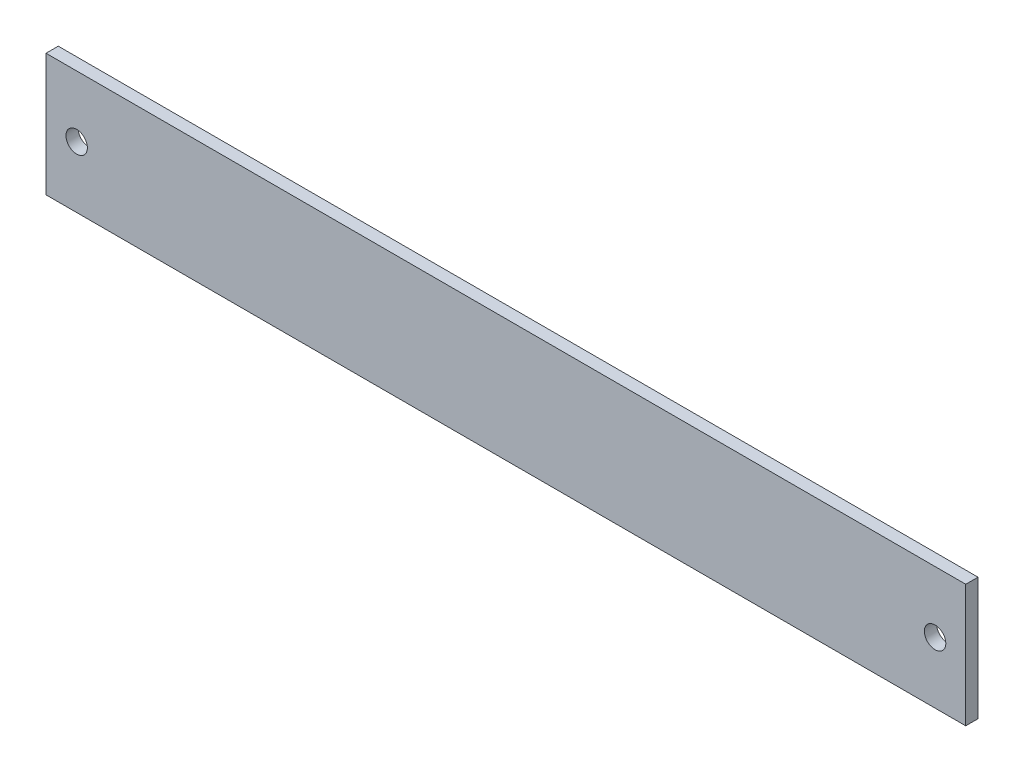
ISO-10303-21;
HEADER;
FILE_DESCRIPTION(('STEP AP214'),'2;1');
FILE_NAME('part.step','',(''),(''),'','','');
FILE_SCHEMA(('AUTOMOTIVE_DESIGN { 1 0 10303 214 1 1 1 1 }'));
ENDSEC;
DATA;
#1=APPLICATION_CONTEXT('core data for automotive mechanical design processes');
#2=APPLICATION_PROTOCOL_DEFINITION('international standard','automotive_design',2000,#1);
#3=PRODUCT_CONTEXT('',#1,'mechanical');
#4=PRODUCT('Part','Part','',(#3));
#5=PRODUCT_RELATED_PRODUCT_CATEGORY('part','',(#4));
#6=PRODUCT_DEFINITION_FORMATION('','',#4);
#7=PRODUCT_DEFINITION_CONTEXT('part definition',#1,'design');
#8=PRODUCT_DEFINITION('design','',#6,#7);
#9=PRODUCT_DEFINITION_SHAPE('','',#8);
#10=(LENGTH_UNIT() NAMED_UNIT(*) SI_UNIT(.MILLI.,.METRE.));
#11=(NAMED_UNIT(*) PLANE_ANGLE_UNIT() SI_UNIT($,.RADIAN.));
#12=(NAMED_UNIT(*) SI_UNIT($,.STERADIAN.) SOLID_ANGLE_UNIT());
#13=UNCERTAINTY_MEASURE_WITH_UNIT(LENGTH_MEASURE(1.E-05),#10,'distance_accuracy_value','');
#14=(GEOMETRIC_REPRESENTATION_CONTEXT(3) GLOBAL_UNCERTAINTY_ASSIGNED_CONTEXT((#13)) GLOBAL_UNIT_ASSIGNED_CONTEXT((#10,
#11,#12)) REPRESENTATION_CONTEXT('',''));
#15=CARTESIAN_POINT('',(0.,0.,0.));
#16=DIRECTION('',(0.,0.,1.));
#17=DIRECTION('',(1.,0.,0.));
#18=AXIS2_PLACEMENT_3D('',#15,#16,#17);
#19=CARTESIAN_POINT('',(75.,-10.,2.));
#20=DIRECTION('',(-1.,0.,0.));
#21=DIRECTION('',(0.,0.,1.));
#22=AXIS2_PLACEMENT_3D('',#19,#20,#21);
#23=PLANE('',#22);
#24=DIRECTION('',(0.,1.,0.));
#25=VECTOR('',#24,1.);
#26=CARTESIAN_POINT('',(75.,-10.,0.));
#27=LINE('',#26,#25);
#28=CARTESIAN_POINT('',(75.,-10.,0.));
#29=VERTEX_POINT('',#28);
#30=CARTESIAN_POINT('',(75.,10.,0.));
#31=VERTEX_POINT('',#30);
#32=EDGE_CURVE('E113',#29,#31,#27,.T.);
#33=ORIENTED_EDGE('',*,*,#32,.T.);
#34=DIRECTION('',(0.,0.,-1.));
#35=VECTOR('',#34,1.);
#36=CARTESIAN_POINT('',(75.,10.,2.));
#37=LINE('',#36,#35);
#38=CARTESIAN_POINT('',(75.,10.,2.));
#39=VERTEX_POINT('',#38);
#40=EDGE_CURVE('E11',#39,#31,#37,.T.);
#41=ORIENTED_EDGE('',*,*,#40,.F.);
#42=DIRECTION('',(0.,1.,0.));
#43=VECTOR('',#42,1.);
#44=CARTESIAN_POINT('',(75.,-10.,2.));
#45=LINE('',#44,#43);
#46=CARTESIAN_POINT('',(75.,-10.,2.));
#47=VERTEX_POINT('',#46);
#48=EDGE_CURVE('E97',#47,#39,#45,.T.);
#49=ORIENTED_EDGE('',*,*,#48,.F.);
#50=DIRECTION('',(0.,0.,-1.));
#51=VECTOR('',#50,1.);
#52=CARTESIAN_POINT('',(75.,-10.,2.));
#53=LINE('',#52,#51);
#54=EDGE_CURVE('E109',#47,#29,#53,.T.);
#55=ORIENTED_EDGE('',*,*,#54,.T.);
#56=EDGE_LOOP('',(#33,#41,#49,#55));
#57=FACE_BOUND('',#56,.T.);
#58=ADVANCED_FACE('F45',(#57),#23,.F.);
#59=CARTESIAN_POINT('',(-75.,10.,2.));
#60=DIRECTION('',(0.,-1.,0.));
#61=DIRECTION('',(0.,0.,-1.));
#62=AXIS2_PLACEMENT_3D('',#59,#60,#61);
#63=PLANE('',#62);
#64=DIRECTION('',(-1.,0.,0.));
#65=VECTOR('',#64,1.);
#66=CARTESIAN_POINT('',(-75.,10.,0.));
#67=LINE('',#66,#65);
#68=CARTESIAN_POINT('',(-75.,10.,0.));
#69=VERTEX_POINT('',#68);
#70=EDGE_CURVE('E102',#31,#69,#67,.T.);
#71=ORIENTED_EDGE('',*,*,#70,.T.);
#72=DIRECTION('',(0.,0.,-1.));
#73=VECTOR('',#72,1.);
#74=CARTESIAN_POINT('',(-75.,10.,2.));
#75=LINE('',#74,#73);
#76=CARTESIAN_POINT('',(-75.,10.,2.));
#77=VERTEX_POINT('',#76);
#78=EDGE_CURVE('E54',#77,#69,#75,.T.);
#79=ORIENTED_EDGE('',*,*,#78,.F.);
#80=DIRECTION('',(-1.,0.,0.));
#81=VECTOR('',#80,1.);
#82=CARTESIAN_POINT('',(-75.,10.,2.));
#83=LINE('',#82,#81);
#84=EDGE_CURVE('E92',#39,#77,#83,.T.);
#85=ORIENTED_EDGE('',*,*,#84,.F.);
#86=ORIENTED_EDGE('',*,*,#40,.T.);
#87=EDGE_LOOP('',(#71,#79,#85,#86));
#88=FACE_BOUND('',#87,.T.);
#89=ADVANCED_FACE('F101',(#88),#63,.F.);
#90=CARTESIAN_POINT('',(-75.,-10.,2.));
#91=DIRECTION('',(1.,0.,0.));
#92=DIRECTION('',(0.,0.,-1.));
#93=AXIS2_PLACEMENT_3D('',#90,#91,#92);
#94=PLANE('',#93);
#95=DIRECTION('',(0.,-1.,0.));
#96=VECTOR('',#95,1.);
#97=CARTESIAN_POINT('',(-75.,-10.,0.));
#98=LINE('',#97,#96);
#99=CARTESIAN_POINT('',(-75.,-10.,0.));
#100=VERTEX_POINT('',#99);
#101=EDGE_CURVE('E79',#69,#100,#98,.T.);
#102=ORIENTED_EDGE('',*,*,#101,.T.);
#103=DIRECTION('',(0.,0.,-1.));
#104=VECTOR('',#103,1.);
#105=CARTESIAN_POINT('',(-75.,-10.,2.));
#106=LINE('',#105,#104);
#107=CARTESIAN_POINT('',(-75.,-10.,2.));
#108=VERTEX_POINT('',#107);
#109=EDGE_CURVE('E104',#108,#100,#106,.T.);
#110=ORIENTED_EDGE('',*,*,#109,.F.);
#111=DIRECTION('',(0.,-1.,0.));
#112=VECTOR('',#111,1.);
#113=CARTESIAN_POINT('',(-75.,-10.,2.));
#114=LINE('',#113,#112);
#115=EDGE_CURVE('E95',#77,#108,#114,.T.);
#116=ORIENTED_EDGE('',*,*,#115,.F.);
#117=ORIENTED_EDGE('',*,*,#78,.T.);
#118=EDGE_LOOP('',(#102,#110,#116,#117));
#119=FACE_BOUND('',#118,.T.);
#120=ADVANCED_FACE('F105',(#119),#94,.F.);
#121=CARTESIAN_POINT('',(-75.,-10.,2.));
#122=DIRECTION('',(0.,1.,0.));
#123=DIRECTION('',(0.,0.,1.));
#124=AXIS2_PLACEMENT_3D('',#121,#122,#123);
#125=PLANE('',#124);
#126=DIRECTION('',(1.,0.,0.));
#127=VECTOR('',#126,1.);
#128=CARTESIAN_POINT('',(-75.,-10.,0.));
#129=LINE('',#128,#127);
#130=EDGE_CURVE('E85',#100,#29,#129,.T.);
#131=ORIENTED_EDGE('',*,*,#130,.T.);
#132=ORIENTED_EDGE('',*,*,#54,.F.);
#133=DIRECTION('',(1.,0.,0.));
#134=VECTOR('',#133,1.);
#135=CARTESIAN_POINT('',(-75.,-10.,2.));
#136=LINE('',#135,#134);
#137=EDGE_CURVE('E62',#108,#47,#136,.T.);
#138=ORIENTED_EDGE('',*,*,#137,.F.);
#139=ORIENTED_EDGE('',*,*,#109,.T.);
#140=EDGE_LOOP('',(#131,#132,#138,#139));
#141=FACE_BOUND('',#140,.T.);
#142=ADVANCED_FACE('F127',(#141),#125,.F.);
#143=CARTESIAN_POINT('',(0.,0.,2.));
#144=DIRECTION('',(0.,0.,-1.));
#145=DIRECTION('',(-1.,0.,0.));
#146=AXIS2_PLACEMENT_3D('',#143,#144,#145);
#147=PLANE('',#146);
#148=CARTESIAN_POINT('',(-70.,0.,2.));
#149=DIRECTION('',(0.,0.,1.));
#150=DIRECTION('',(1.,0.,0.));
#151=AXIS2_PLACEMENT_3D('',#148,#149,#150);
#152=CIRCLE('',#151,1.75);
#153=CARTESIAN_POINT('',(-68.25,0.,2.));
#154=VERTEX_POINT('',#153);
#155=EDGE_CURVE('E117',#154,#154,#152,.T.);
#156=ORIENTED_EDGE('',*,*,#155,.F.);
#157=EDGE_LOOP('',(#156));
#158=FACE_BOUND('',#157,.T.);
#159=CARTESIAN_POINT('',(70.,0.,2.));
#160=DIRECTION('',(0.,0.,1.));
#161=DIRECTION('',(-1.,0.,0.));
#162=AXIS2_PLACEMENT_3D('',#159,#160,#161);
#163=CIRCLE('',#162,1.75);
#164=CARTESIAN_POINT('',(68.25,0.,2.));
#165=VERTEX_POINT('',#164);
#166=EDGE_CURVE('E134',#165,#165,#163,.T.);
#167=ORIENTED_EDGE('',*,*,#166,.F.);
#168=EDGE_LOOP('',(#167));
#169=FACE_BOUND('',#168,.T.);
#170=ORIENTED_EDGE('',*,*,#48,.T.);
#171=ORIENTED_EDGE('',*,*,#84,.T.);
#172=ORIENTED_EDGE('',*,*,#115,.T.);
#173=ORIENTED_EDGE('',*,*,#137,.T.);
#174=EDGE_LOOP('',(#170,#171,#172,#173));
#175=FACE_BOUND('',#174,.T.);
#176=ADVANCED_FACE('F93',(#158,#169,#175),#147,.F.);
#177=CARTESIAN_POINT('',(0.,0.,0.));
#178=DIRECTION('',(0.,0.,-1.));
#179=DIRECTION('',(-1.,0.,0.));
#180=AXIS2_PLACEMENT_3D('',#177,#178,#179);
#181=PLANE('',#180);
#182=CARTESIAN_POINT('',(-70.,0.,0.));
#183=DIRECTION('',(0.,0.,-1.));
#184=DIRECTION('',(-1.,0.,0.));
#185=AXIS2_PLACEMENT_3D('',#182,#183,#184);
#186=CIRCLE('',#185,1.75);
#187=CARTESIAN_POINT('',(-71.75,0.,0.));
#188=VERTEX_POINT('',#187);
#189=EDGE_CURVE('E142',#188,#188,#186,.F.);
#190=ORIENTED_EDGE('',*,*,#189,.T.);
#191=EDGE_LOOP('',(#190));
#192=FACE_BOUND('',#191,.T.);
#193=CARTESIAN_POINT('',(70.,0.,0.));
#194=DIRECTION('',(0.,0.,-1.));
#195=DIRECTION('',(-1.,0.,0.));
#196=AXIS2_PLACEMENT_3D('',#193,#194,#195);
#197=CIRCLE('',#196,1.75);
#198=CARTESIAN_POINT('',(68.25,0.,0.));
#199=VERTEX_POINT('',#198);
#200=EDGE_CURVE('E138',#199,#199,#197,.F.);
#201=ORIENTED_EDGE('',*,*,#200,.T.);
#202=EDGE_LOOP('',(#201));
#203=FACE_BOUND('',#202,.T.);
#204=ORIENTED_EDGE('',*,*,#32,.F.);
#205=ORIENTED_EDGE('',*,*,#130,.F.);
#206=ORIENTED_EDGE('',*,*,#101,.F.);
#207=ORIENTED_EDGE('',*,*,#70,.F.);
#208=EDGE_LOOP('',(#204,#205,#206,#207));
#209=FACE_BOUND('',#208,.T.);
#210=ADVANCED_FACE('F130',(#192,#203,#209),#181,.T.);
#211=CARTESIAN_POINT('',(70.,0.,-0.00100000000000013));
#212=DIRECTION('',(0.,0.,1.));
#213=DIRECTION('',(1.,0.,0.));
#214=AXIS2_PLACEMENT_3D('',#211,#212,#213);
#215=CYLINDRICAL_SURFACE('',#214,1.75);
#216=ORIENTED_EDGE('',*,*,#200,.F.);
#217=EDGE_LOOP('',(#216));
#218=FACE_BOUND('',#217,.T.);
#219=ORIENTED_EDGE('',*,*,#166,.T.);
#220=EDGE_LOOP('',(#219));
#221=FACE_BOUND('',#220,.T.);
#222=ADVANCED_FACE('F157',(#218,#221),#215,.F.);
#223=CARTESIAN_POINT('',(-70.,0.,-0.00100000000000013));
#224=DIRECTION('',(0.,0.,1.));
#225=DIRECTION('',(1.,0.,0.));
#226=AXIS2_PLACEMENT_3D('',#223,#224,#225);
#227=CYLINDRICAL_SURFACE('',#226,1.75);
#228=ORIENTED_EDGE('',*,*,#189,.F.);
#229=EDGE_LOOP('',(#228));
#230=FACE_BOUND('',#229,.T.);
#231=ORIENTED_EDGE('',*,*,#155,.T.);
#232=EDGE_LOOP('',(#231));
#233=FACE_BOUND('',#232,.T.);
#234=ADVANCED_FACE('F150',(#230,#233),#227,.F.);
#235=CLOSED_SHELL('',(#58,#89,#120,#142,#176,#210,#222,#234));
#236=MANIFOLD_SOLID_BREP('B2',#235);
#237=ADVANCED_BREP_SHAPE_REPRESENTATION('',(#18,#236),#14);
#238=SHAPE_DEFINITION_REPRESENTATION(#9,#237);
ENDSEC;
END-ISO-10303-21;
